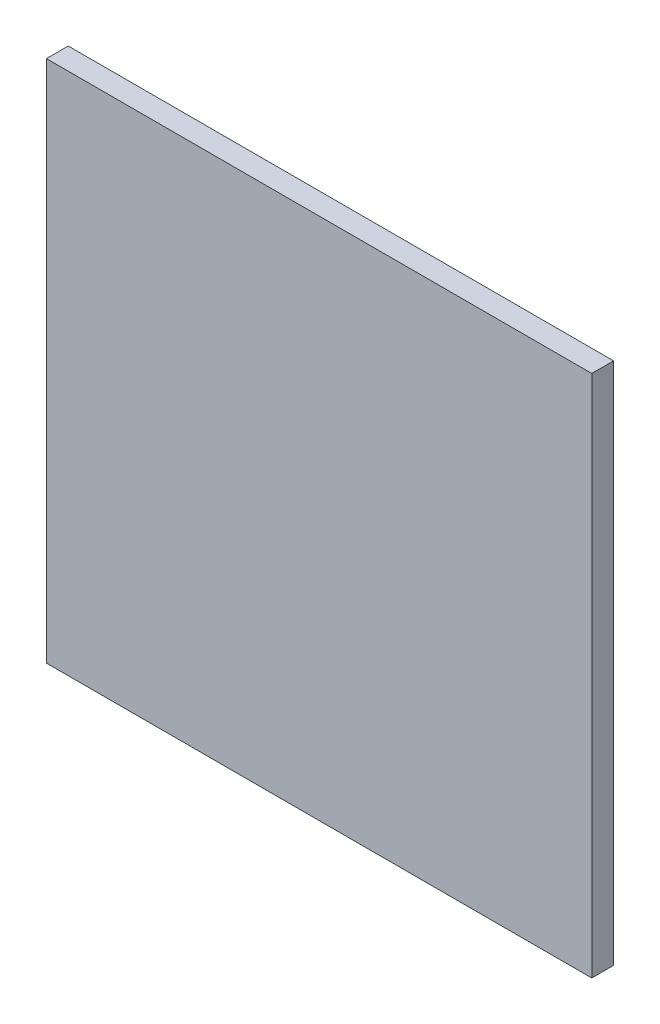
ISO-10303-21;
HEADER;
FILE_DESCRIPTION(('STEP AP214'),'2;1');
FILE_NAME('part.step','',(''),(''),'','','');
FILE_SCHEMA(('AUTOMOTIVE_DESIGN { 1 0 10303 214 1 1 1 1 }'));
ENDSEC;
DATA;
#1=APPLICATION_CONTEXT('core data for automotive mechanical design processes');
#2=APPLICATION_PROTOCOL_DEFINITION('international standard','automotive_design',2000,#1);
#3=PRODUCT_CONTEXT('',#1,'mechanical');
#4=PRODUCT('Part','Part','',(#3));
#5=PRODUCT_RELATED_PRODUCT_CATEGORY('part','',(#4));
#6=PRODUCT_DEFINITION_FORMATION('','',#4);
#7=PRODUCT_DEFINITION_CONTEXT('part definition',#1,'design');
#8=PRODUCT_DEFINITION('design','',#6,#7);
#9=PRODUCT_DEFINITION_SHAPE('','',#8);
#10=(LENGTH_UNIT() NAMED_UNIT(*) SI_UNIT(.MILLI.,.METRE.));
#11=(NAMED_UNIT(*) PLANE_ANGLE_UNIT() SI_UNIT($,.RADIAN.));
#12=(NAMED_UNIT(*) SI_UNIT($,.STERADIAN.) SOLID_ANGLE_UNIT());
#13=UNCERTAINTY_MEASURE_WITH_UNIT(LENGTH_MEASURE(1.E-05),#10,'distance_accuracy_value','');
#14=(GEOMETRIC_REPRESENTATION_CONTEXT(3) GLOBAL_UNCERTAINTY_ASSIGNED_CONTEXT((#13)) GLOBAL_UNIT_ASSIGNED_CONTEXT((#10,
#11,#12)) REPRESENTATION_CONTEXT('',''));
#15=CARTESIAN_POINT('',(0.,0.,0.));
#16=DIRECTION('',(0.,0.,1.));
#17=DIRECTION('',(1.,0.,0.));
#18=AXIS2_PLACEMENT_3D('',#15,#16,#17);
#19=CARTESIAN_POINT('',(24.7749999998769,50.9999996003197,-0.59999999987181));
#20=DIRECTION('',(2.05103306050651E-10,0.,1.));
#21=DIRECTION('',(1.,0.,-2.05103306050651E-10));
#22=AXIS2_PLACEMENT_3D('',#19,#20,#21);
#23=PLANE('',#22);
#24=DIRECTION('',(0.,1.,0.));
#25=VECTOR('',#24,1.);
#26=CARTESIAN_POINT('',(26.0249999998769,50.9999996003197,-0.60000000012819));
#27=LINE('',#26,#25);
#28=CARTESIAN_POINT('',(26.0249999998795,49.749,-0.60000000012819));
#29=VERTEX_POINT('',#28);
#30=CARTESIAN_POINT('',(26.0249999998795,48.549,-0.60000000012819));
#31=VERTEX_POINT('',#30);
#32=EDGE_CURVE('E20',#29,#31,#27,.F.);
#33=ORIENTED_EDGE('',*,*,#32,.T.);
#34=DIRECTION('',(-1.,0.,0.));
#35=VECTOR('',#34,1.);
#36=CARTESIAN_POINT('',(24.7749999998872,48.549,-0.60000000012819));
#37=LINE('',#36,#35);
#38=CARTESIAN_POINT('',(24.7749999998769,48.549,-0.6));
#39=VERTEX_POINT('',#38);
#40=EDGE_CURVE('E55',#31,#39,#37,.T.);
#41=ORIENTED_EDGE('',*,*,#40,.T.);
#42=DIRECTION('',(0.,1.,0.));
#43=VECTOR('',#42,1.);
#44=CARTESIAN_POINT('',(24.7749999998769,50.9999996003197,-0.59999999987181));
#45=LINE('',#44,#43);
#46=CARTESIAN_POINT('',(24.7749999998769,49.749,-0.599999999935905));
#47=VERTEX_POINT('',#46);
#48=EDGE_CURVE('E74',#39,#47,#45,.T.);
#49=ORIENTED_EDGE('',*,*,#48,.T.);
#50=DIRECTION('',(-1.,0.,0.));
#51=VECTOR('',#50,1.);
#52=CARTESIAN_POINT('',(24.7749999998769,49.749,-0.60000000012819));
#53=LINE('',#52,#51);
#54=EDGE_CURVE('E66',#29,#47,#53,.T.);
#55=ORIENTED_EDGE('',*,*,#54,.F.);
#56=EDGE_LOOP('',(#33,#41,#49,#55));
#57=FACE_BOUND('',#56,.T.);
#58=ADVANCED_FACE('F17',(#57),#23,.F.);
#59=CARTESIAN_POINT('',(26.0249999998769,50.9999996003197,-0.60000000012819));
#60=DIRECTION('',(-1.,0.,2.05103306050651E-10));
#61=DIRECTION('',(2.05103306050651E-10,0.,1.));
#62=AXIS2_PLACEMENT_3D('',#59,#60,#61);
#63=PLANE('',#62);
#64=DIRECTION('',(0.,1.,0.));
#65=VECTOR('',#64,1.);
#66=CARTESIAN_POINT('',(26.0249999998872,50.9999996003197,-0.550000000128189));
#67=LINE('',#66,#65);
#68=CARTESIAN_POINT('',(26.0249999998872,49.749,-0.550000000064095));
#69=VERTEX_POINT('',#68);
#70=CARTESIAN_POINT('',(26.0249999998872,48.549,-0.550000000064095));
#71=VERTEX_POINT('',#70);
#72=EDGE_CURVE('E72',#69,#71,#67,.F.);
#73=ORIENTED_EDGE('',*,*,#72,.T.);
#74=DIRECTION('',(0.,0.,1.));
#75=VECTOR('',#74,1.);
#76=CARTESIAN_POINT('',(26.0249999998872,48.549,-0.54999999987181));
#77=LINE('',#76,#75);
#78=EDGE_CURVE('E62',#71,#31,#77,.F.);
#79=ORIENTED_EDGE('',*,*,#78,.T.);
#80=ORIENTED_EDGE('',*,*,#32,.F.);
#81=DIRECTION('',(0.,0.,1.));
#82=VECTOR('',#81,1.);
#83=CARTESIAN_POINT('',(26.0249999998872,49.749,-0.59999999987181));
#84=LINE('',#83,#82);
#85=EDGE_CURVE('E78',#69,#29,#84,.F.);
#86=ORIENTED_EDGE('',*,*,#85,.F.);
#87=EDGE_LOOP('',(#73,#79,#80,#86));
#88=FACE_BOUND('',#87,.T.);
#89=ADVANCED_FACE('F71',(#88),#63,.F.);
#90=CARTESIAN_POINT('',(24.7749999998872,48.549,-0.54999999987181));
#91=DIRECTION('',(0.,1.,0.));
#92=DIRECTION('',(-1.,0.,0.));
#93=AXIS2_PLACEMENT_3D('',#90,#91,#92);
#94=PLANE('',#93);
#95=DIRECTION('',(-1.,0.,2.05103306050651E-10));
#96=VECTOR('',#95,1.);
#97=CARTESIAN_POINT('',(24.7749999998872,48.549,-0.54999999987181));
#98=LINE('',#97,#96);
#99=CARTESIAN_POINT('',(24.774999999882,48.549,-0.54999999987181));
#100=VERTEX_POINT('',#99);
#101=EDGE_CURVE('E83',#71,#100,#98,.T.);
#102=ORIENTED_EDGE('',*,*,#101,.T.);
#103=DIRECTION('',(-2.05103306050651E-10,0.,-1.));
#104=VECTOR('',#103,1.);
#105=CARTESIAN_POINT('',(24.7749999998769,48.549,-0.59999999987181));
#106=LINE('',#105,#104);
#107=EDGE_CURVE('E64',#100,#39,#106,.T.);
#108=ORIENTED_EDGE('',*,*,#107,.T.);
#109=ORIENTED_EDGE('',*,*,#40,.F.);
#110=ORIENTED_EDGE('',*,*,#78,.F.);
#111=EDGE_LOOP('',(#102,#108,#109,#110));
#112=FACE_BOUND('',#111,.T.);
#113=ADVANCED_FACE('F60',(#112),#94,.F.);
#114=CARTESIAN_POINT('',(24.7749999998769,50.9999996003197,-0.59999999987181));
#115=DIRECTION('',(1.,0.,-2.05103306050651E-10));
#116=DIRECTION('',(-2.05103306050651E-10,0.,-1.));
#117=AXIS2_PLACEMENT_3D('',#114,#115,#116);
#118=PLANE('',#117);
#119=ORIENTED_EDGE('',*,*,#48,.F.);
#120=ORIENTED_EDGE('',*,*,#107,.F.);
#121=DIRECTION('',(0.,1.,0.));
#122=VECTOR('',#121,1.);
#123=CARTESIAN_POINT('',(24.7749999998872,50.9999996003197,-0.54999999987181));
#124=LINE('',#123,#122);
#125=CARTESIAN_POINT('',(24.7749999998846,49.749,-0.54999999987181));
#126=VERTEX_POINT('',#125);
#127=EDGE_CURVE('E26',#100,#126,#124,.T.);
#128=ORIENTED_EDGE('',*,*,#127,.T.);
#129=DIRECTION('',(0.,0.,1.));
#130=VECTOR('',#129,1.);
#131=CARTESIAN_POINT('',(24.7749999998769,49.749,-0.59999999987181));
#132=LINE('',#131,#130);
#133=EDGE_CURVE('E34',#47,#126,#132,.T.);
#134=ORIENTED_EDGE('',*,*,#133,.F.);
#135=EDGE_LOOP('',(#119,#120,#128,#134));
#136=FACE_BOUND('',#135,.T.);
#137=ADVANCED_FACE('F88',(#136),#118,.F.);
#138=CARTESIAN_POINT('',(24.7749999998769,49.749,-0.59999999987181));
#139=DIRECTION('',(0.,1.,0.));
#140=DIRECTION('',(-1.,0.,0.));
#141=AXIS2_PLACEMENT_3D('',#138,#139,#140);
#142=PLANE('',#141);
#143=ORIENTED_EDGE('',*,*,#54,.T.);
#144=ORIENTED_EDGE('',*,*,#133,.T.);
#145=DIRECTION('',(-1.,0.,2.05103306050651E-10));
#146=VECTOR('',#145,1.);
#147=CARTESIAN_POINT('',(24.7749999998872,49.749,-0.54999999987181));
#148=LINE('',#147,#146);
#149=EDGE_CURVE('E11',#126,#69,#148,.F.);
#150=ORIENTED_EDGE('',*,*,#149,.T.);
#151=ORIENTED_EDGE('',*,*,#85,.T.);
#152=EDGE_LOOP('',(#143,#144,#150,#151));
#153=FACE_BOUND('',#152,.T.);
#154=ADVANCED_FACE('F91',(#153),#142,.T.);
#155=CARTESIAN_POINT('',(24.7749999998872,50.9999996003197,-0.54999999987181));
#156=DIRECTION('',(-2.05103306050651E-10,0.,-1.));
#157=DIRECTION('',(-1.,0.,2.05103306050651E-10));
#158=AXIS2_PLACEMENT_3D('',#155,#156,#157);
#159=PLANE('',#158);
#160=ORIENTED_EDGE('',*,*,#127,.F.);
#161=ORIENTED_EDGE('',*,*,#101,.F.);
#162=ORIENTED_EDGE('',*,*,#72,.F.);
#163=ORIENTED_EDGE('',*,*,#149,.F.);
#164=EDGE_LOOP('',(#160,#161,#162,#163));
#165=FACE_BOUND('',#164,.T.);
#166=ADVANCED_FACE('F90',(#165),#159,.F.);
#167=CLOSED_SHELL('',(#58,#89,#113,#137,#154,#166));
#168=MANIFOLD_SOLID_BREP('B1',#167);
#169=ADVANCED_BREP_SHAPE_REPRESENTATION('',(#18,#168),#14);
#170=SHAPE_DEFINITION_REPRESENTATION(#9,#169);
ENDSEC;
END-ISO-10303-21;
